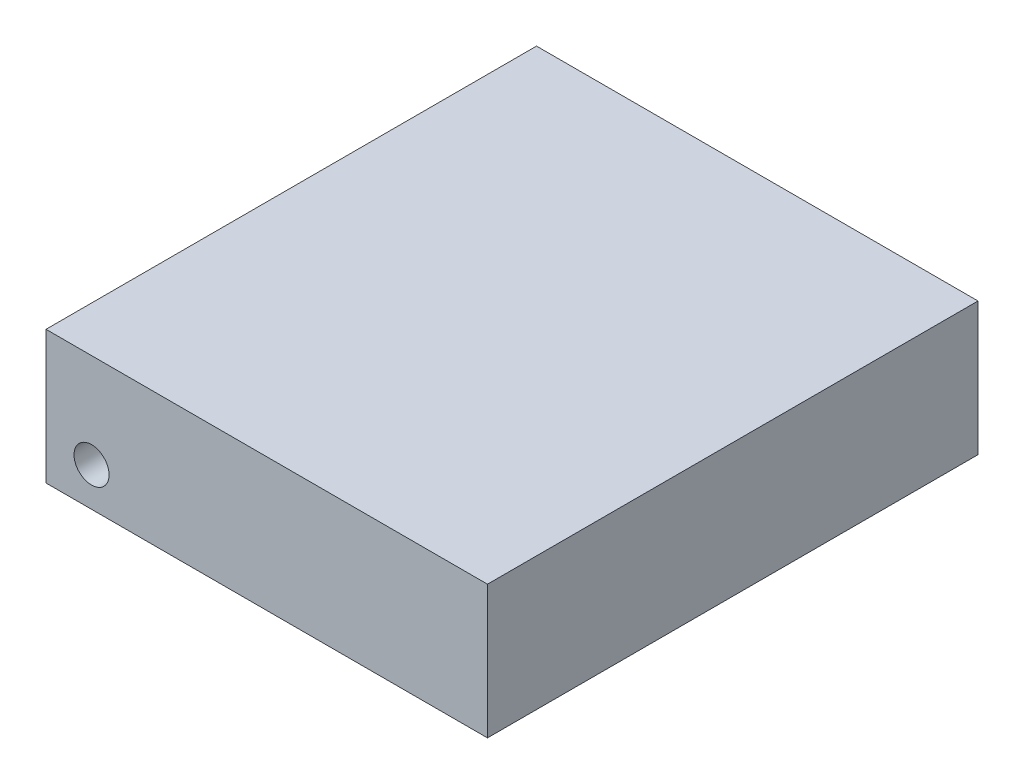
ISO-10303-21;
HEADER;
FILE_DESCRIPTION(('STEP AP214'),'2;1');
FILE_NAME('part.step','',(''),(''),'','','');
FILE_SCHEMA(('AUTOMOTIVE_DESIGN { 1 0 10303 214 1 1 1 1 }'));
ENDSEC;
DATA;
#1=APPLICATION_CONTEXT('core data for automotive mechanical design processes');
#2=APPLICATION_PROTOCOL_DEFINITION('international standard','automotive_design',2000,#1);
#3=PRODUCT_CONTEXT('',#1,'mechanical');
#4=PRODUCT('Part','Part','',(#3));
#5=PRODUCT_RELATED_PRODUCT_CATEGORY('part','',(#4));
#6=PRODUCT_DEFINITION_FORMATION('','',#4);
#7=PRODUCT_DEFINITION_CONTEXT('part definition',#1,'design');
#8=PRODUCT_DEFINITION('design','',#6,#7);
#9=PRODUCT_DEFINITION_SHAPE('','',#8);
#10=(LENGTH_UNIT() NAMED_UNIT(*) SI_UNIT(.MILLI.,.METRE.));
#11=(NAMED_UNIT(*) PLANE_ANGLE_UNIT() SI_UNIT($,.RADIAN.));
#12=(NAMED_UNIT(*) SI_UNIT($,.STERADIAN.) SOLID_ANGLE_UNIT());
#13=UNCERTAINTY_MEASURE_WITH_UNIT(LENGTH_MEASURE(1.E-05),#10,'distance_accuracy_value','');
#14=(GEOMETRIC_REPRESENTATION_CONTEXT(3) GLOBAL_UNCERTAINTY_ASSIGNED_CONTEXT((#13)) GLOBAL_UNIT_ASSIGNED_CONTEXT((#10,
#11,#12)) REPRESENTATION_CONTEXT('',''));
#15=CARTESIAN_POINT('',(0.,0.,0.));
#16=DIRECTION('',(0.,0.,1.));
#17=DIRECTION('',(1.,0.,0.));
#18=AXIS2_PLACEMENT_3D('',#15,#16,#17);
#19=CARTESIAN_POINT('',(0.,19.,0.));
#20=DIRECTION('',(1.,0.,0.));
#21=DIRECTION('',(0.,0.,-1.));
#22=AXIS2_PLACEMENT_3D('',#19,#20,#21);
#23=PLANE('',#22);
#24=DIRECTION('',(0.,0.,1.));
#25=VECTOR('',#24,1.);
#26=CARTESIAN_POINT('',(0.,0.,0.));
#27=LINE('',#26,#25);
#28=CARTESIAN_POINT('',(0.,0.,-70.));
#29=VERTEX_POINT('',#28);
#30=CARTESIAN_POINT('',(0.,0.,0.));
#31=VERTEX_POINT('',#30);
#32=EDGE_CURVE('E96',#29,#31,#27,.T.);
#33=ORIENTED_EDGE('',*,*,#32,.T.);
#34=DIRECTION('',(0.,-1.,0.));
#35=VECTOR('',#34,1.);
#36=CARTESIAN_POINT('',(0.,19.,0.));
#37=LINE('',#36,#35);
#38=CARTESIAN_POINT('',(0.,19.,0.));
#39=VERTEX_POINT('',#38);
#40=EDGE_CURVE('E11',#39,#31,#37,.T.);
#41=ORIENTED_EDGE('',*,*,#40,.F.);
#42=DIRECTION('',(0.,0.,1.));
#43=VECTOR('',#42,1.);
#44=CARTESIAN_POINT('',(0.,19.,0.));
#45=LINE('',#44,#43);
#46=CARTESIAN_POINT('',(0.,19.,-70.));
#47=VERTEX_POINT('',#46);
#48=EDGE_CURVE('E84',#47,#39,#45,.T.);
#49=ORIENTED_EDGE('',*,*,#48,.F.);
#50=DIRECTION('',(0.,-1.,0.));
#51=VECTOR('',#50,1.);
#52=CARTESIAN_POINT('',(0.,19.,-70.));
#53=LINE('',#52,#51);
#54=EDGE_CURVE('E92',#47,#29,#53,.T.);
#55=ORIENTED_EDGE('',*,*,#54,.T.);
#56=EDGE_LOOP('',(#33,#41,#49,#55));
#57=FACE_BOUND('',#56,.T.);
#58=ADVANCED_FACE('F33',(#57),#23,.F.);
#59=CARTESIAN_POINT('',(0.,19.,0.));
#60=DIRECTION('',(0.,0.,-1.));
#61=DIRECTION('',(-1.,0.,0.));
#62=AXIS2_PLACEMENT_3D('',#59,#60,#61);
#63=PLANE('',#62);
#64=CARTESIAN_POINT('',(6.5,5.5,0.));
#65=DIRECTION('',(0.,0.,1.));
#66=DIRECTION('',(1.,0.,0.));
#67=AXIS2_PLACEMENT_3D('',#64,#65,#66);
#68=CIRCLE('',#67,2.5);
#69=CARTESIAN_POINT('',(9.,5.5,0.));
#70=VERTEX_POINT('',#69);
#71=EDGE_CURVE('E110',#70,#70,#68,.T.);
#72=ORIENTED_EDGE('',*,*,#71,.F.);
#73=EDGE_LOOP('',(#72));
#74=FACE_BOUND('',#73,.T.);
#75=DIRECTION('',(1.,0.,0.));
#76=VECTOR('',#75,1.);
#77=CARTESIAN_POINT('',(0.,0.,0.));
#78=LINE('',#77,#76);
#79=CARTESIAN_POINT('',(63.,0.,0.));
#80=VERTEX_POINT('',#79);
#81=EDGE_CURVE('E88',#31,#80,#78,.T.);
#82=ORIENTED_EDGE('',*,*,#81,.T.);
#83=DIRECTION('',(0.,-1.,0.));
#84=VECTOR('',#83,1.);
#85=CARTESIAN_POINT('',(63.,19.,0.));
#86=LINE('',#85,#84);
#87=CARTESIAN_POINT('',(63.,19.,0.));
#88=VERTEX_POINT('',#87);
#89=EDGE_CURVE('E41',#88,#80,#86,.T.);
#90=ORIENTED_EDGE('',*,*,#89,.F.);
#91=DIRECTION('',(1.,0.,0.));
#92=VECTOR('',#91,1.);
#93=CARTESIAN_POINT('',(0.,19.,0.));
#94=LINE('',#93,#92);
#95=EDGE_CURVE('E79',#39,#88,#94,.T.);
#96=ORIENTED_EDGE('',*,*,#95,.F.);
#97=ORIENTED_EDGE('',*,*,#40,.T.);
#98=EDGE_LOOP('',(#82,#90,#96,#97));
#99=FACE_BOUND('',#98,.T.);
#100=ADVANCED_FACE('F87',(#74,#99),#63,.F.);
#101=CARTESIAN_POINT('',(63.,19.,0.));
#102=DIRECTION('',(-1.,0.,0.));
#103=DIRECTION('',(0.,0.,1.));
#104=AXIS2_PLACEMENT_3D('',#101,#102,#103);
#105=PLANE('',#104);
#106=DIRECTION('',(0.,0.,-1.));
#107=VECTOR('',#106,1.);
#108=CARTESIAN_POINT('',(63.,0.,0.));
#109=LINE('',#108,#107);
#110=CARTESIAN_POINT('',(63.,0.,-70.));
#111=VERTEX_POINT('',#110);
#112=EDGE_CURVE('E66',#80,#111,#109,.T.);
#113=ORIENTED_EDGE('',*,*,#112,.T.);
#114=DIRECTION('',(0.,-1.,0.));
#115=VECTOR('',#114,1.);
#116=CARTESIAN_POINT('',(63.,19.,-70.));
#117=LINE('',#116,#115);
#118=CARTESIAN_POINT('',(63.,19.,-70.));
#119=VERTEX_POINT('',#118);
#120=EDGE_CURVE('E89',#119,#111,#117,.T.);
#121=ORIENTED_EDGE('',*,*,#120,.F.);
#122=DIRECTION('',(0.,0.,-1.));
#123=VECTOR('',#122,1.);
#124=CARTESIAN_POINT('',(63.,19.,0.));
#125=LINE('',#124,#123);
#126=EDGE_CURVE('E82',#88,#119,#125,.T.);
#127=ORIENTED_EDGE('',*,*,#126,.F.);
#128=ORIENTED_EDGE('',*,*,#89,.T.);
#129=EDGE_LOOP('',(#113,#121,#127,#128));
#130=FACE_BOUND('',#129,.T.);
#131=ADVANCED_FACE('F90',(#130),#105,.F.);
#132=CARTESIAN_POINT('',(0.,19.,-70.));
#133=DIRECTION('',(0.,0.,1.));
#134=DIRECTION('',(1.,0.,0.));
#135=AXIS2_PLACEMENT_3D('',#132,#133,#134);
#136=PLANE('',#135);
#137=DIRECTION('',(-1.,0.,0.));
#138=VECTOR('',#137,1.);
#139=CARTESIAN_POINT('',(0.,0.,-70.));
#140=LINE('',#139,#138);
#141=EDGE_CURVE('E72',#111,#29,#140,.T.);
#142=ORIENTED_EDGE('',*,*,#141,.T.);
#143=ORIENTED_EDGE('',*,*,#54,.F.);
#144=DIRECTION('',(-1.,0.,0.));
#145=VECTOR('',#144,1.);
#146=CARTESIAN_POINT('',(0.,19.,-70.));
#147=LINE('',#146,#145);
#148=EDGE_CURVE('E49',#119,#47,#147,.T.);
#149=ORIENTED_EDGE('',*,*,#148,.F.);
#150=ORIENTED_EDGE('',*,*,#120,.T.);
#151=EDGE_LOOP('',(#142,#143,#149,#150));
#152=FACE_BOUND('',#151,.T.);
#153=ADVANCED_FACE('F104',(#152),#136,.F.);
#154=CARTESIAN_POINT('',(0.,19.,0.));
#155=DIRECTION('',(0.,-1.,0.));
#156=DIRECTION('',(0.,0.,-1.));
#157=AXIS2_PLACEMENT_3D('',#154,#155,#156);
#158=PLANE('',#157);
#159=ORIENTED_EDGE('',*,*,#48,.T.);
#160=ORIENTED_EDGE('',*,*,#95,.T.);
#161=ORIENTED_EDGE('',*,*,#126,.T.);
#162=ORIENTED_EDGE('',*,*,#148,.T.);
#163=EDGE_LOOP('',(#159,#160,#161,#162));
#164=FACE_BOUND('',#163,.T.);
#165=ADVANCED_FACE('F80',(#164),#158,.F.);
#166=CARTESIAN_POINT('',(0.,0.,0.));
#167=DIRECTION('',(0.,-1.,0.));
#168=DIRECTION('',(0.,0.,-1.));
#169=AXIS2_PLACEMENT_3D('',#166,#167,#168);
#170=PLANE('',#169);
#171=ORIENTED_EDGE('',*,*,#32,.F.);
#172=ORIENTED_EDGE('',*,*,#141,.F.);
#173=ORIENTED_EDGE('',*,*,#112,.F.);
#174=ORIENTED_EDGE('',*,*,#81,.F.);
#175=EDGE_LOOP('',(#171,#172,#173,#174));
#176=FACE_BOUND('',#175,.T.);
#177=ADVANCED_FACE('F107',(#176),#170,.T.);
#178=CARTESIAN_POINT('',(6.5,5.5,-10.));
#179=DIRECTION('',(0.,0.,1.));
#180=DIRECTION('',(1.,0.,0.));
#181=AXIS2_PLACEMENT_3D('',#178,#179,#180);
#182=CYLINDRICAL_SURFACE('',#181,2.5);
#183=CARTESIAN_POINT('',(6.5,5.5,-10.));
#184=DIRECTION('',(0.,0.,1.));
#185=DIRECTION('',(1.,0.,0.));
#186=AXIS2_PLACEMENT_3D('',#183,#184,#185);
#187=CIRCLE('',#186,2.5);
#188=CARTESIAN_POINT('',(9.,5.5,-10.));
#189=VERTEX_POINT('',#188);
#190=EDGE_CURVE('E99',#189,#189,#187,.T.);
#191=ORIENTED_EDGE('',*,*,#190,.F.);
#192=EDGE_LOOP('',(#191));
#193=FACE_BOUND('',#192,.T.);
#194=ORIENTED_EDGE('',*,*,#71,.T.);
#195=EDGE_LOOP('',(#194));
#196=FACE_BOUND('',#195,.T.);
#197=ADVANCED_FACE('F118',(#193,#196),#182,.F.);
#198=CARTESIAN_POINT('',(6.5,5.5,-10.));
#199=DIRECTION('',(0.,0.,1.));
#200=DIRECTION('',(1.,0.,0.));
#201=AXIS2_PLACEMENT_3D('',#198,#199,#200);
#202=PLANE('',#201);
#203=ORIENTED_EDGE('',*,*,#190,.T.);
#204=EDGE_LOOP('',(#203));
#205=FACE_BOUND('',#204,.T.);
#206=ADVANCED_FACE('F116',(#205),#202,.T.);
#207=CLOSED_SHELL('',(#58,#100,#131,#153,#165,#177,#197,#206));
#208=MANIFOLD_SOLID_BREP('B2',#207);
#209=ADVANCED_BREP_SHAPE_REPRESENTATION('',(#18,#208),#14);
#210=SHAPE_DEFINITION_REPRESENTATION(#9,#209);
ENDSEC;
END-ISO-10303-21;
